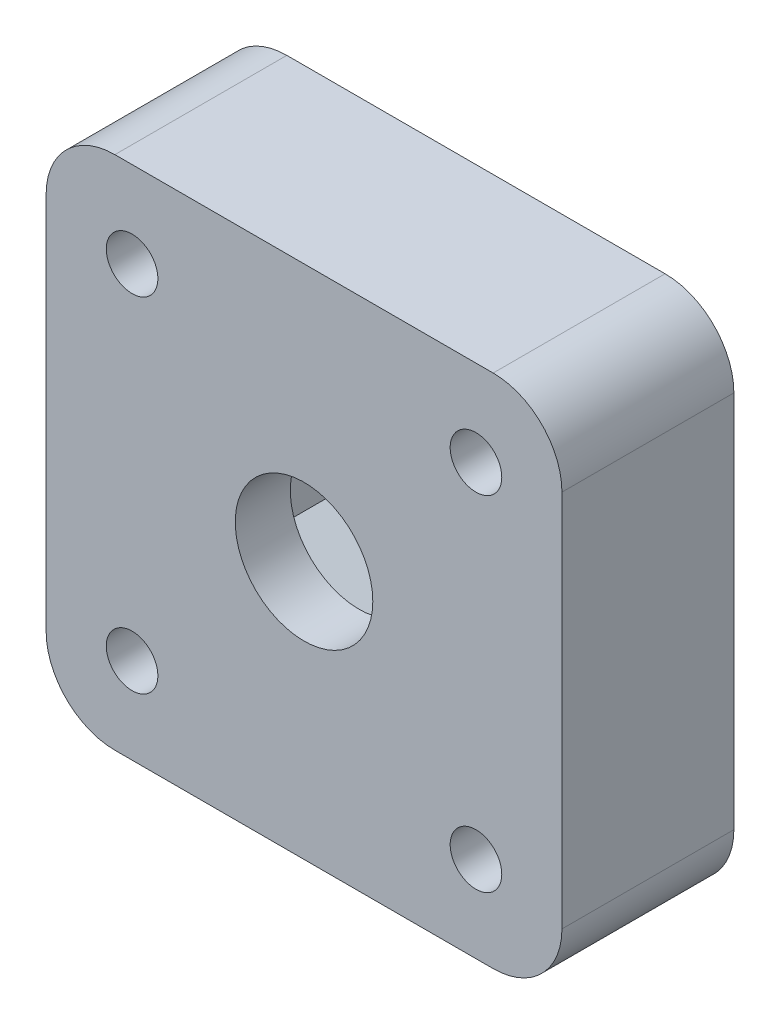
ISO-10303-21;
HEADER;
FILE_DESCRIPTION(('STEP AP214'),'2;1');
FILE_NAME('part.step','',(''),(''),'','','');
FILE_SCHEMA(('AUTOMOTIVE_DESIGN { 1 0 10303 214 1 1 1 1 }'));
ENDSEC;
DATA;
#1=APPLICATION_CONTEXT('core data for automotive mechanical design processes');
#2=APPLICATION_PROTOCOL_DEFINITION('international standard','automotive_design',2000,#1);
#3=PRODUCT_CONTEXT('',#1,'mechanical');
#4=PRODUCT('Part','Part','',(#3));
#5=PRODUCT_RELATED_PRODUCT_CATEGORY('part','',(#4));
#6=PRODUCT_DEFINITION_FORMATION('','',#4);
#7=PRODUCT_DEFINITION_CONTEXT('part definition',#1,'design');
#8=PRODUCT_DEFINITION('design','',#6,#7);
#9=PRODUCT_DEFINITION_SHAPE('','',#8);
#10=(LENGTH_UNIT() NAMED_UNIT(*) SI_UNIT(.MILLI.,.METRE.));
#11=(NAMED_UNIT(*) PLANE_ANGLE_UNIT() SI_UNIT($,.RADIAN.));
#12=(NAMED_UNIT(*) SI_UNIT($,.STERADIAN.) SOLID_ANGLE_UNIT());
#13=UNCERTAINTY_MEASURE_WITH_UNIT(LENGTH_MEASURE(1.E-05),#10,'distance_accuracy_value','');
#14=(GEOMETRIC_REPRESENTATION_CONTEXT(3) GLOBAL_UNCERTAINTY_ASSIGNED_CONTEXT((#13)) GLOBAL_UNIT_ASSIGNED_CONTEXT((#10,
#11,#12)) REPRESENTATION_CONTEXT('',''));
#15=CARTESIAN_POINT('',(0.,0.,0.));
#16=DIRECTION('',(0.,0.,1.));
#17=DIRECTION('',(1.,0.,0.));
#18=AXIS2_PLACEMENT_3D('',#15,#16,#17);
#19=CARTESIAN_POINT('',(0.,0.,0.));
#20=DIRECTION('',(0.,0.,1.));
#21=DIRECTION('',(1.,0.,0.));
#22=AXIS2_PLACEMENT_3D('',#19,#20,#21);
#23=PLANE('',#22);
#24=CARTESIAN_POINT('',(-10.,-10.,0.));
#25=DIRECTION('',(0.,0.,1.));
#26=DIRECTION('',(1.,0.,0.));
#27=AXIS2_PLACEMENT_3D('',#24,#25,#26);
#28=CIRCLE('',#27,1.5);
#29=CARTESIAN_POINT('',(-8.5,-10.,0.));
#30=VERTEX_POINT('',#29);
#31=EDGE_CURVE('E174',#30,#30,#28,.F.);
#32=ORIENTED_EDGE('',*,*,#31,.F.);
#33=EDGE_LOOP('',(#32));
#34=FACE_BOUND('',#33,.T.);
#35=CARTESIAN_POINT('',(10.,-10.,0.));
#36=DIRECTION('',(0.,0.,1.));
#37=DIRECTION('',(1.,0.,0.));
#38=AXIS2_PLACEMENT_3D('',#35,#36,#37);
#39=CIRCLE('',#38,1.5);
#40=CARTESIAN_POINT('',(11.5,-10.,0.));
#41=VERTEX_POINT('',#40);
#42=EDGE_CURVE('E213',#41,#41,#39,.T.);
#43=ORIENTED_EDGE('',*,*,#42,.T.);
#44=EDGE_LOOP('',(#43));
#45=FACE_BOUND('',#44,.T.);
#46=DIRECTION('',(0.,1.,0.));
#47=VECTOR('',#46,1.);
#48=CARTESIAN_POINT('',(-15.,0.,0.));
#49=LINE('',#48,#47);
#50=CARTESIAN_POINT('',(-15.,-11.,0.));
#51=VERTEX_POINT('',#50);
#52=CARTESIAN_POINT('',(-15.,11.,0.));
#53=VERTEX_POINT('',#52);
#54=EDGE_CURVE('E210',#51,#53,#49,.T.);
#55=ORIENTED_EDGE('',*,*,#54,.T.);
#56=CARTESIAN_POINT('',(-11.,11.,0.));
#57=DIRECTION('',(0.,0.,1.));
#58=DIRECTION('',(1.,0.,0.));
#59=AXIS2_PLACEMENT_3D('',#56,#57,#58);
#60=CIRCLE('',#59,4.);
#61=CARTESIAN_POINT('',(-11.,15.,0.));
#62=VERTEX_POINT('',#61);
#63=EDGE_CURVE('E228',#53,#62,#60,.F.);
#64=ORIENTED_EDGE('',*,*,#63,.T.);
#65=DIRECTION('',(1.,0.,0.));
#66=VECTOR('',#65,1.);
#67=CARTESIAN_POINT('',(0.,15.,0.));
#68=LINE('',#67,#66);
#69=CARTESIAN_POINT('',(11.,15.,0.));
#70=VERTEX_POINT('',#69);
#71=EDGE_CURVE('E207',#62,#70,#68,.T.);
#72=ORIENTED_EDGE('',*,*,#71,.T.);
#73=CARTESIAN_POINT('',(11.,11.,0.));
#74=DIRECTION('',(0.,0.,1.));
#75=DIRECTION('',(1.,0.,0.));
#76=AXIS2_PLACEMENT_3D('',#73,#74,#75);
#77=CIRCLE('',#76,4.);
#78=CARTESIAN_POINT('',(15.,11.,0.));
#79=VERTEX_POINT('',#78);
#80=EDGE_CURVE('E222',#70,#79,#77,.F.);
#81=ORIENTED_EDGE('',*,*,#80,.T.);
#82=DIRECTION('',(0.,1.,0.));
#83=VECTOR('',#82,1.);
#84=CARTESIAN_POINT('',(15.,0.,0.));
#85=LINE('',#84,#83);
#86=CARTESIAN_POINT('',(15.,-11.,0.));
#87=VERTEX_POINT('',#86);
#88=EDGE_CURVE('E205',#87,#79,#85,.T.);
#89=ORIENTED_EDGE('',*,*,#88,.F.);
#90=CARTESIAN_POINT('',(11.,-11.,0.));
#91=DIRECTION('',(0.,0.,1.));
#92=DIRECTION('',(1.,0.,0.));
#93=AXIS2_PLACEMENT_3D('',#90,#91,#92);
#94=CIRCLE('',#93,4.);
#95=CARTESIAN_POINT('',(11.,-15.,0.));
#96=VERTEX_POINT('',#95);
#97=EDGE_CURVE('E224',#87,#96,#94,.F.);
#98=ORIENTED_EDGE('',*,*,#97,.T.);
#99=DIRECTION('',(1.,0.,0.));
#100=VECTOR('',#99,1.);
#101=CARTESIAN_POINT('',(0.,-15.,0.));
#102=LINE('',#101,#100);
#103=CARTESIAN_POINT('',(-11.,-15.,0.));
#104=VERTEX_POINT('',#103);
#105=EDGE_CURVE('E202',#104,#96,#102,.T.);
#106=ORIENTED_EDGE('',*,*,#105,.F.);
#107=CARTESIAN_POINT('',(-11.,-11.,0.));
#108=DIRECTION('',(0.,0.,1.));
#109=DIRECTION('',(1.,0.,0.));
#110=AXIS2_PLACEMENT_3D('',#107,#108,#109);
#111=CIRCLE('',#110,4.);
#112=EDGE_CURVE('E226',#104,#51,#111,.F.);
#113=ORIENTED_EDGE('',*,*,#112,.T.);
#114=EDGE_LOOP('',(#55,#64,#72,#81,#89,#98,#106,#113));
#115=FACE_BOUND('',#114,.T.);
#116=CARTESIAN_POINT('',(-10.,10.,0.));
#117=DIRECTION('',(0.,0.,1.));
#118=DIRECTION('',(1.,0.,0.));
#119=AXIS2_PLACEMENT_3D('',#116,#117,#118);
#120=CIRCLE('',#119,1.5);
#121=CARTESIAN_POINT('',(-8.5,10.,0.));
#122=VERTEX_POINT('',#121);
#123=EDGE_CURVE('E199',#122,#122,#120,.T.);
#124=ORIENTED_EDGE('',*,*,#123,.T.);
#125=EDGE_LOOP('',(#124));
#126=FACE_BOUND('',#125,.T.);
#127=CARTESIAN_POINT('',(10.,10.,0.));
#128=DIRECTION('',(0.,0.,1.));
#129=DIRECTION('',(1.,0.,0.));
#130=AXIS2_PLACEMENT_3D('',#127,#128,#129);
#131=CIRCLE('',#130,1.5);
#132=CARTESIAN_POINT('',(11.5,10.,0.));
#133=VERTEX_POINT('',#132);
#134=EDGE_CURVE('E164',#133,#133,#131,.F.);
#135=ORIENTED_EDGE('',*,*,#134,.F.);
#136=EDGE_LOOP('',(#135));
#137=FACE_BOUND('',#136,.T.);
#138=DIRECTION('',(-0.866025403784438,0.5,0.));
#139=VECTOR('',#138,1.);
#140=CARTESIAN_POINT('',(6.,3.46410161513775,0.));
#141=LINE('',#140,#139);
#142=CARTESIAN_POINT('',(6.,3.46410161513775,0.));
#143=VERTEX_POINT('',#142);
#144=CARTESIAN_POINT('',(0.,6.92820323027551,0.));
#145=VERTEX_POINT('',#144);
#146=EDGE_CURVE('E333',#143,#145,#141,.T.);
#147=ORIENTED_EDGE('',*,*,#146,.T.);
#148=DIRECTION('',(-0.866025403784439,-0.5,0.));
#149=VECTOR('',#148,1.);
#150=CARTESIAN_POINT('',(0.,6.92820323027551,0.));
#151=LINE('',#150,#149);
#152=CARTESIAN_POINT('',(-6.,3.46410161513775,0.));
#153=VERTEX_POINT('',#152);
#154=EDGE_CURVE('E159',#145,#153,#151,.T.);
#155=ORIENTED_EDGE('',*,*,#154,.T.);
#156=DIRECTION('',(0.,-1.,0.));
#157=VECTOR('',#156,1.);
#158=CARTESIAN_POINT('',(-6.,3.46410161513775,0.));
#159=LINE('',#158,#157);
#160=CARTESIAN_POINT('',(-6.,-3.46410161513776,0.));
#161=VERTEX_POINT('',#160);
#162=EDGE_CURVE('E338',#153,#161,#159,.T.);
#163=ORIENTED_EDGE('',*,*,#162,.T.);
#164=DIRECTION('',(0.866025403784438,-0.5,0.));
#165=VECTOR('',#164,1.);
#166=CARTESIAN_POINT('',(-6.,-3.46410161513776,0.));
#167=LINE('',#166,#165);
#168=CARTESIAN_POINT('',(0.,-6.92820323027551,0.));
#169=VERTEX_POINT('',#168);
#170=EDGE_CURVE('E345',#161,#169,#167,.T.);
#171=ORIENTED_EDGE('',*,*,#170,.T.);
#172=DIRECTION('',(0.866025403784438,0.5,0.));
#173=VECTOR('',#172,1.);
#174=CARTESIAN_POINT('',(0.,-6.92820323027551,0.));
#175=LINE('',#174,#173);
#176=CARTESIAN_POINT('',(6.,-3.46410161513776,0.));
#177=VERTEX_POINT('',#176);
#178=EDGE_CURVE('E348',#169,#177,#175,.T.);
#179=ORIENTED_EDGE('',*,*,#178,.T.);
#180=DIRECTION('',(0.,1.,0.));
#181=VECTOR('',#180,1.);
#182=CARTESIAN_POINT('',(6.,-3.46410161513776,0.));
#183=LINE('',#182,#181);
#184=EDGE_CURVE('E155',#177,#143,#183,.T.);
#185=ORIENTED_EDGE('',*,*,#184,.T.);
#186=EDGE_LOOP('',(#147,#155,#163,#171,#179,#185));
#187=FACE_BOUND('',#186,.T.);
#188=ADVANCED_FACE('F34',(#34,#45,#115,#126,#137,#187),#23,.F.);
#189=CARTESIAN_POINT('',(0.,-15.,10.));
#190=DIRECTION('',(0.,1.,0.));
#191=DIRECTION('',(0.,0.,1.));
#192=AXIS2_PLACEMENT_3D('',#189,#190,#191);
#193=PLANE('',#192);
#194=DIRECTION('',(1.,0.,0.));
#195=VECTOR('',#194,1.);
#196=CARTESIAN_POINT('',(0.,-15.,10.));
#197=LINE('',#196,#195);
#198=CARTESIAN_POINT('',(-11.,-15.,10.));
#199=VERTEX_POINT('',#198);
#200=CARTESIAN_POINT('',(11.,-15.,10.));
#201=VERTEX_POINT('',#200);
#202=EDGE_CURVE('E177',#199,#201,#197,.T.);
#203=ORIENTED_EDGE('',*,*,#202,.F.);
#204=DIRECTION('',(0.,0.,-1.));
#205=VECTOR('',#204,1.);
#206=CARTESIAN_POINT('',(-11.,-15.,0.));
#207=LINE('',#206,#205);
#208=EDGE_CURVE('E244',#199,#104,#207,.T.);
#209=ORIENTED_EDGE('',*,*,#208,.T.);
#210=ORIENTED_EDGE('',*,*,#105,.T.);
#211=DIRECTION('',(0.,0.,-1.));
#212=VECTOR('',#211,1.);
#213=CARTESIAN_POINT('',(11.,-15.,10.));
#214=LINE('',#213,#212);
#215=EDGE_CURVE('E242',#96,#201,#214,.F.);
#216=ORIENTED_EDGE('',*,*,#215,.T.);
#217=EDGE_LOOP('',(#203,#209,#210,#216));
#218=FACE_BOUND('',#217,.T.);
#219=ADVANCED_FACE('F250',(#218),#193,.F.);
#220=CARTESIAN_POINT('',(15.,0.,10.));
#221=DIRECTION('',(-1.,0.,0.));
#222=DIRECTION('',(0.,0.,1.));
#223=AXIS2_PLACEMENT_3D('',#220,#221,#222);
#224=PLANE('',#223);
#225=DIRECTION('',(0.,1.,0.));
#226=VECTOR('',#225,1.);
#227=CARTESIAN_POINT('',(15.,0.,10.));
#228=LINE('',#227,#226);
#229=CARTESIAN_POINT('',(15.,-11.,10.));
#230=VERTEX_POINT('',#229);
#231=CARTESIAN_POINT('',(15.,11.,10.));
#232=VERTEX_POINT('',#231);
#233=EDGE_CURVE('E179',#230,#232,#228,.T.);
#234=ORIENTED_EDGE('',*,*,#233,.F.);
#235=DIRECTION('',(0.,0.,-1.));
#236=VECTOR('',#235,1.);
#237=CARTESIAN_POINT('',(15.,-11.,10.));
#238=LINE('',#237,#236);
#239=EDGE_CURVE('E11',#230,#87,#238,.T.);
#240=ORIENTED_EDGE('',*,*,#239,.T.);
#241=ORIENTED_EDGE('',*,*,#88,.T.);
#242=DIRECTION('',(0.,0.,-1.));
#243=VECTOR('',#242,1.);
#244=CARTESIAN_POINT('',(15.,11.,10.));
#245=LINE('',#244,#243);
#246=EDGE_CURVE('E42',#79,#232,#245,.F.);
#247=ORIENTED_EDGE('',*,*,#246,.T.);
#248=EDGE_LOOP('',(#234,#240,#241,#247));
#249=FACE_BOUND('',#248,.T.);
#250=ADVANCED_FACE('F261',(#249),#224,.F.);
#251=CARTESIAN_POINT('',(0.,15.,10.));
#252=DIRECTION('',(0.,1.,0.));
#253=DIRECTION('',(0.,0.,1.));
#254=AXIS2_PLACEMENT_3D('',#251,#252,#253);
#255=PLANE('',#254);
#256=ORIENTED_EDGE('',*,*,#71,.F.);
#257=DIRECTION('',(0.,0.,-1.));
#258=VECTOR('',#257,1.);
#259=CARTESIAN_POINT('',(-11.,15.,10.));
#260=LINE('',#259,#258);
#261=CARTESIAN_POINT('',(-11.,15.,10.));
#262=VERTEX_POINT('',#261);
#263=EDGE_CURVE('E233',#62,#262,#260,.F.);
#264=ORIENTED_EDGE('',*,*,#263,.T.);
#265=DIRECTION('',(1.,0.,0.));
#266=VECTOR('',#265,1.);
#267=CARTESIAN_POINT('',(0.,15.,10.));
#268=LINE('',#267,#266);
#269=CARTESIAN_POINT('',(11.,15.,10.));
#270=VERTEX_POINT('',#269);
#271=EDGE_CURVE('E181',#262,#270,#268,.T.);
#272=ORIENTED_EDGE('',*,*,#271,.T.);
#273=DIRECTION('',(0.,0.,-1.));
#274=VECTOR('',#273,1.);
#275=CARTESIAN_POINT('',(11.,15.,0.));
#276=LINE('',#275,#274);
#277=EDGE_CURVE('E230',#270,#70,#276,.T.);
#278=ORIENTED_EDGE('',*,*,#277,.T.);
#279=EDGE_LOOP('',(#256,#264,#272,#278));
#280=FACE_BOUND('',#279,.T.);
#281=ADVANCED_FACE('F270',(#280),#255,.T.);
#282=CARTESIAN_POINT('',(-10.,-10.,10.));
#283=DIRECTION('',(0.,0.,-1.));
#284=DIRECTION('',(-1.,0.,0.));
#285=AXIS2_PLACEMENT_3D('',#282,#283,#284);
#286=CYLINDRICAL_SURFACE('',#285,1.5);
#287=CARTESIAN_POINT('',(-10.,-10.,10.));
#288=DIRECTION('',(0.,0.,1.));
#289=DIRECTION('',(1.,0.,0.));
#290=AXIS2_PLACEMENT_3D('',#287,#288,#289);
#291=CIRCLE('',#290,1.5);
#292=CARTESIAN_POINT('',(-8.5,-10.,10.));
#293=VERTEX_POINT('',#292);
#294=EDGE_CURVE('E190',#293,#293,#291,.F.);
#295=ORIENTED_EDGE('',*,*,#294,.F.);
#296=EDGE_LOOP('',(#295));
#297=FACE_BOUND('',#296,.T.);
#298=ORIENTED_EDGE('',*,*,#31,.T.);
#299=EDGE_LOOP('',(#298));
#300=FACE_BOUND('',#299,.T.);
#301=ADVANCED_FACE('F305',(#297,#300),#286,.F.);
#302=CARTESIAN_POINT('',(10.,-10.,10.));
#303=DIRECTION('',(0.,0.,-1.));
#304=DIRECTION('',(-1.,0.,0.));
#305=AXIS2_PLACEMENT_3D('',#302,#303,#304);
#306=CYLINDRICAL_SURFACE('',#305,1.5);
#307=CARTESIAN_POINT('',(10.,-10.,10.));
#308=DIRECTION('',(0.,0.,1.));
#309=DIRECTION('',(1.,0.,0.));
#310=AXIS2_PLACEMENT_3D('',#307,#308,#309);
#311=CIRCLE('',#310,1.5);
#312=CARTESIAN_POINT('',(11.5,-10.,10.));
#313=VERTEX_POINT('',#312);
#314=EDGE_CURVE('E187',#313,#313,#311,.T.);
#315=ORIENTED_EDGE('',*,*,#314,.T.);
#316=EDGE_LOOP('',(#315));
#317=FACE_BOUND('',#316,.T.);
#318=ORIENTED_EDGE('',*,*,#42,.F.);
#319=EDGE_LOOP('',(#318));
#320=FACE_BOUND('',#319,.T.);
#321=ADVANCED_FACE('F308',(#317,#320),#306,.F.);
#322=CARTESIAN_POINT('',(-15.,0.,10.));
#323=DIRECTION('',(-1.,0.,0.));
#324=DIRECTION('',(0.,0.,1.));
#325=AXIS2_PLACEMENT_3D('',#322,#323,#324);
#326=PLANE('',#325);
#327=DIRECTION('',(0.,1.,0.));
#328=VECTOR('',#327,1.);
#329=CARTESIAN_POINT('',(-15.,0.,10.));
#330=LINE('',#329,#328);
#331=CARTESIAN_POINT('',(-15.,-11.,10.));
#332=VERTEX_POINT('',#331);
#333=CARTESIAN_POINT('',(-15.,11.,10.));
#334=VERTEX_POINT('',#333);
#335=EDGE_CURVE('E184',#332,#334,#330,.T.);
#336=ORIENTED_EDGE('',*,*,#335,.T.);
#337=DIRECTION('',(0.,0.,-1.));
#338=VECTOR('',#337,1.);
#339=CARTESIAN_POINT('',(-15.,11.,10.));
#340=LINE('',#339,#338);
#341=EDGE_CURVE('E219',#334,#53,#340,.T.);
#342=ORIENTED_EDGE('',*,*,#341,.T.);
#343=ORIENTED_EDGE('',*,*,#54,.F.);
#344=DIRECTION('',(0.,0.,-1.));
#345=VECTOR('',#344,1.);
#346=CARTESIAN_POINT('',(-15.,-11.,10.));
#347=LINE('',#346,#345);
#348=EDGE_CURVE('E196',#51,#332,#347,.F.);
#349=ORIENTED_EDGE('',*,*,#348,.T.);
#350=EDGE_LOOP('',(#336,#342,#343,#349));
#351=FACE_BOUND('',#350,.T.);
#352=ADVANCED_FACE('F277',(#351),#326,.T.);
#353=CARTESIAN_POINT('',(-10.,10.,10.));
#354=DIRECTION('',(0.,0.,-1.));
#355=DIRECTION('',(-1.,0.,0.));
#356=AXIS2_PLACEMENT_3D('',#353,#354,#355);
#357=CYLINDRICAL_SURFACE('',#356,1.5);
#358=CARTESIAN_POINT('',(-10.,10.,10.));
#359=DIRECTION('',(0.,0.,1.));
#360=DIRECTION('',(1.,0.,0.));
#361=AXIS2_PLACEMENT_3D('',#358,#359,#360);
#362=CIRCLE('',#361,1.5);
#363=CARTESIAN_POINT('',(-8.5,10.,10.));
#364=VERTEX_POINT('',#363);
#365=EDGE_CURVE('E173',#364,#364,#362,.T.);
#366=ORIENTED_EDGE('',*,*,#365,.T.);
#367=EDGE_LOOP('',(#366));
#368=FACE_BOUND('',#367,.T.);
#369=ORIENTED_EDGE('',*,*,#123,.F.);
#370=EDGE_LOOP('',(#369));
#371=FACE_BOUND('',#370,.T.);
#372=ADVANCED_FACE('F315',(#368,#371),#357,.F.);
#373=CARTESIAN_POINT('',(10.,10.,10.));
#374=DIRECTION('',(0.,0.,-1.));
#375=DIRECTION('',(-1.,0.,0.));
#376=AXIS2_PLACEMENT_3D('',#373,#374,#375);
#377=CYLINDRICAL_SURFACE('',#376,1.5);
#378=CARTESIAN_POINT('',(10.,10.,10.));
#379=DIRECTION('',(0.,0.,1.));
#380=DIRECTION('',(1.,0.,0.));
#381=AXIS2_PLACEMENT_3D('',#378,#379,#380);
#382=CIRCLE('',#381,1.5);
#383=CARTESIAN_POINT('',(11.5,10.,10.));
#384=VERTEX_POINT('',#383);
#385=EDGE_CURVE('E170',#384,#384,#382,.F.);
#386=ORIENTED_EDGE('',*,*,#385,.F.);
#387=EDGE_LOOP('',(#386));
#388=FACE_BOUND('',#387,.T.);
#389=ORIENTED_EDGE('',*,*,#134,.T.);
#390=EDGE_LOOP('',(#389));
#391=FACE_BOUND('',#390,.T.);
#392=ADVANCED_FACE('F303',(#388,#391),#377,.F.);
#393=CARTESIAN_POINT('',(0.,0.,10.));
#394=DIRECTION('',(0.,0.,-1.));
#395=DIRECTION('',(-1.,0.,0.));
#396=AXIS2_PLACEMENT_3D('',#393,#394,#395);
#397=CYLINDRICAL_SURFACE('',#396,4.);
#398=CARTESIAN_POINT('',(0.,0.,6.8));
#399=DIRECTION('',(0.,0.,1.));
#400=DIRECTION('',(1.,0.,0.));
#401=AXIS2_PLACEMENT_3D('',#398,#399,#400);
#402=CIRCLE('',#401,4.);
#403=CARTESIAN_POINT('',(4.,0.,6.8));
#404=VERTEX_POINT('',#403);
#405=EDGE_CURVE('E160',#404,#404,#402,.T.);
#406=ORIENTED_EDGE('',*,*,#405,.F.);
#407=EDGE_LOOP('',(#406));
#408=FACE_BOUND('',#407,.T.);
#409=CARTESIAN_POINT('',(0.,0.,10.));
#410=DIRECTION('',(0.,0.,1.));
#411=DIRECTION('',(1.,0.,0.));
#412=AXIS2_PLACEMENT_3D('',#409,#410,#411);
#413=CIRCLE('',#412,4.);
#414=CARTESIAN_POINT('',(4.,0.,10.));
#415=VERTEX_POINT('',#414);
#416=EDGE_CURVE('E193',#415,#415,#413,.T.);
#417=ORIENTED_EDGE('',*,*,#416,.T.);
#418=EDGE_LOOP('',(#417));
#419=FACE_BOUND('',#418,.T.);
#420=ADVANCED_FACE('F300',(#408,#419),#397,.F.);
#421=CARTESIAN_POINT('',(0.,0.,10.));
#422=DIRECTION('',(0.,0.,1.));
#423=DIRECTION('',(1.,0.,0.));
#424=AXIS2_PLACEMENT_3D('',#421,#422,#423);
#425=PLANE('',#424);
#426=ORIENTED_EDGE('',*,*,#385,.T.);
#427=EDGE_LOOP('',(#426));
#428=FACE_BOUND('',#427,.T.);
#429=ORIENTED_EDGE('',*,*,#365,.F.);
#430=EDGE_LOOP('',(#429));
#431=FACE_BOUND('',#430,.T.);
#432=ORIENTED_EDGE('',*,*,#271,.F.);
#433=CARTESIAN_POINT('',(-11.,11.,10.));
#434=DIRECTION('',(0.,0.,1.));
#435=DIRECTION('',(1.,0.,0.));
#436=AXIS2_PLACEMENT_3D('',#433,#434,#435);
#437=CIRCLE('',#436,4.);
#438=EDGE_CURVE('E240',#262,#334,#437,.T.);
#439=ORIENTED_EDGE('',*,*,#438,.T.);
#440=ORIENTED_EDGE('',*,*,#335,.F.);
#441=CARTESIAN_POINT('',(-11.,-11.,10.));
#442=DIRECTION('',(0.,0.,1.));
#443=DIRECTION('',(1.,0.,0.));
#444=AXIS2_PLACEMENT_3D('',#441,#442,#443);
#445=CIRCLE('',#444,4.);
#446=EDGE_CURVE('E238',#332,#199,#445,.T.);
#447=ORIENTED_EDGE('',*,*,#446,.T.);
#448=ORIENTED_EDGE('',*,*,#202,.T.);
#449=CARTESIAN_POINT('',(11.,-11.,10.));
#450=DIRECTION('',(0.,0.,1.));
#451=DIRECTION('',(1.,0.,0.));
#452=AXIS2_PLACEMENT_3D('',#449,#450,#451);
#453=CIRCLE('',#452,4.);
#454=EDGE_CURVE('E55',#201,#230,#453,.T.);
#455=ORIENTED_EDGE('',*,*,#454,.T.);
#456=ORIENTED_EDGE('',*,*,#233,.T.);
#457=CARTESIAN_POINT('',(11.,11.,10.));
#458=DIRECTION('',(0.,0.,1.));
#459=DIRECTION('',(1.,0.,0.));
#460=AXIS2_PLACEMENT_3D('',#457,#458,#459);
#461=CIRCLE('',#460,4.);
#462=EDGE_CURVE('E235',#232,#270,#461,.T.);
#463=ORIENTED_EDGE('',*,*,#462,.T.);
#464=EDGE_LOOP('',(#432,#439,#440,#447,#448,#455,#456,#463));
#465=FACE_BOUND('',#464,.T.);
#466=ORIENTED_EDGE('',*,*,#314,.F.);
#467=EDGE_LOOP('',(#466));
#468=FACE_BOUND('',#467,.T.);
#469=ORIENTED_EDGE('',*,*,#294,.T.);
#470=EDGE_LOOP('',(#469));
#471=FACE_BOUND('',#470,.T.);
#472=ORIENTED_EDGE('',*,*,#416,.F.);
#473=EDGE_LOOP('',(#472));
#474=FACE_BOUND('',#473,.T.);
#475=ADVANCED_FACE('F264',(#428,#431,#465,#468,#471,#474),#425,.T.);
#476=CARTESIAN_POINT('',(6.,3.46410161513775,6.8));
#477=DIRECTION('',(-0.5,-0.866025403784438,0.));
#478=DIRECTION('',(0.866025403784439,-0.5,0.));
#479=AXIS2_PLACEMENT_3D('',#476,#477,#478);
#480=PLANE('',#479);
#481=ORIENTED_EDGE('',*,*,#146,.F.);
#482=DIRECTION('',(0.,0.,-1.));
#483=VECTOR('',#482,1.);
#484=CARTESIAN_POINT('',(6.,3.46410161513775,6.8));
#485=LINE('',#484,#483);
#486=CARTESIAN_POINT('',(6.,3.46410161513775,6.8));
#487=VERTEX_POINT('',#486);
#488=EDGE_CURVE('E154',#487,#143,#485,.T.);
#489=ORIENTED_EDGE('',*,*,#488,.F.);
#490=DIRECTION('',(-0.866025403784438,0.5,0.));
#491=VECTOR('',#490,1.);
#492=CARTESIAN_POINT('',(6.,3.46410161513775,6.8));
#493=LINE('',#492,#491);
#494=CARTESIAN_POINT('',(0.,6.92820323027551,6.8));
#495=VERTEX_POINT('',#494);
#496=EDGE_CURVE('E140',#487,#495,#493,.T.);
#497=ORIENTED_EDGE('',*,*,#496,.T.);
#498=DIRECTION('',(0.,0.,-1.));
#499=VECTOR('',#498,1.);
#500=CARTESIAN_POINT('',(0.,6.92820323027551,6.8));
#501=LINE('',#500,#499);
#502=EDGE_CURVE('E151',#495,#145,#501,.T.);
#503=ORIENTED_EDGE('',*,*,#502,.T.);
#504=EDGE_LOOP('',(#481,#489,#497,#503));
#505=FACE_BOUND('',#504,.T.);
#506=ADVANCED_FACE('F150',(#505),#480,.T.);
#507=CARTESIAN_POINT('',(0.,6.92820323027551,6.8));
#508=DIRECTION('',(0.5,-0.866025403784439,0.));
#509=DIRECTION('',(0.866025403784439,0.5,0.));
#510=AXIS2_PLACEMENT_3D('',#507,#508,#509);
#511=PLANE('',#510);
#512=ORIENTED_EDGE('',*,*,#154,.F.);
#513=ORIENTED_EDGE('',*,*,#502,.F.);
#514=DIRECTION('',(-0.866025403784439,-0.5,0.));
#515=VECTOR('',#514,1.);
#516=CARTESIAN_POINT('',(0.,6.92820323027551,6.8));
#517=LINE('',#516,#515);
#518=CARTESIAN_POINT('',(-6.,3.46410161513775,6.8));
#519=VERTEX_POINT('',#518);
#520=EDGE_CURVE('E136',#495,#519,#517,.T.);
#521=ORIENTED_EDGE('',*,*,#520,.T.);
#522=DIRECTION('',(0.,0.,-1.));
#523=VECTOR('',#522,1.);
#524=CARTESIAN_POINT('',(-6.,3.46410161513775,6.8));
#525=LINE('',#524,#523);
#526=EDGE_CURVE('E161',#519,#153,#525,.T.);
#527=ORIENTED_EDGE('',*,*,#526,.T.);
#528=EDGE_LOOP('',(#512,#513,#521,#527));
#529=FACE_BOUND('',#528,.T.);
#530=ADVANCED_FACE('F157',(#529),#511,.T.);
#531=CARTESIAN_POINT('',(-6.,3.46410161513775,6.8));
#532=DIRECTION('',(1.,0.,0.));
#533=DIRECTION('',(0.,0.,-1.));
#534=AXIS2_PLACEMENT_3D('',#531,#532,#533);
#535=PLANE('',#534);
#536=ORIENTED_EDGE('',*,*,#162,.F.);
#537=ORIENTED_EDGE('',*,*,#526,.F.);
#538=DIRECTION('',(0.,-1.,0.));
#539=VECTOR('',#538,1.);
#540=CARTESIAN_POINT('',(-6.,3.46410161513775,6.8));
#541=LINE('',#540,#539);
#542=CARTESIAN_POINT('',(-6.,-3.46410161513776,6.8));
#543=VERTEX_POINT('',#542);
#544=EDGE_CURVE('E142',#519,#543,#541,.T.);
#545=ORIENTED_EDGE('',*,*,#544,.T.);
#546=DIRECTION('',(0.,0.,-1.));
#547=VECTOR('',#546,1.);
#548=CARTESIAN_POINT('',(-6.,-3.46410161513776,6.8));
#549=LINE('',#548,#547);
#550=EDGE_CURVE('E166',#543,#161,#549,.T.);
#551=ORIENTED_EDGE('',*,*,#550,.T.);
#552=EDGE_LOOP('',(#536,#537,#545,#551));
#553=FACE_BOUND('',#552,.T.);
#554=ADVANCED_FACE('F359',(#553),#535,.T.);
#555=CARTESIAN_POINT('',(-6.,-3.46410161513776,6.8));
#556=DIRECTION('',(0.5,0.866025403784439,0.));
#557=DIRECTION('',(-0.866025403784439,0.5,0.));
#558=AXIS2_PLACEMENT_3D('',#555,#556,#557);
#559=PLANE('',#558);
#560=ORIENTED_EDGE('',*,*,#170,.F.);
#561=ORIENTED_EDGE('',*,*,#550,.F.);
#562=DIRECTION('',(0.866025403784438,-0.5,0.));
#563=VECTOR('',#562,1.);
#564=CARTESIAN_POINT('',(-6.,-3.46410161513776,6.8));
#565=LINE('',#564,#563);
#566=CARTESIAN_POINT('',(0.,-6.92820323027551,6.8));
#567=VERTEX_POINT('',#566);
#568=EDGE_CURVE('E371',#543,#567,#565,.T.);
#569=ORIENTED_EDGE('',*,*,#568,.T.);
#570=DIRECTION('',(0.,0.,-1.));
#571=VECTOR('',#570,1.);
#572=CARTESIAN_POINT('',(0.,-6.92820323027551,6.8));
#573=LINE('',#572,#571);
#574=EDGE_CURVE('E354',#567,#169,#573,.T.);
#575=ORIENTED_EDGE('',*,*,#574,.T.);
#576=EDGE_LOOP('',(#560,#561,#569,#575));
#577=FACE_BOUND('',#576,.T.);
#578=ADVANCED_FACE('F361',(#577),#559,.T.);
#579=CARTESIAN_POINT('',(0.,-6.92820323027551,6.8));
#580=DIRECTION('',(-0.5,0.866025403784439,0.));
#581=DIRECTION('',(-0.866025403784439,-0.5,0.));
#582=AXIS2_PLACEMENT_3D('',#579,#580,#581);
#583=PLANE('',#582);
#584=ORIENTED_EDGE('',*,*,#178,.F.);
#585=ORIENTED_EDGE('',*,*,#574,.F.);
#586=DIRECTION('',(0.866025403784438,0.5,0.));
#587=VECTOR('',#586,1.);
#588=CARTESIAN_POINT('',(0.,-6.92820323027551,6.8));
#589=LINE('',#588,#587);
#590=CARTESIAN_POINT('',(6.,-3.46410161513776,6.8));
#591=VERTEX_POINT('',#590);
#592=EDGE_CURVE('E368',#567,#591,#589,.T.);
#593=ORIENTED_EDGE('',*,*,#592,.T.);
#594=DIRECTION('',(0.,0.,-1.));
#595=VECTOR('',#594,1.);
#596=CARTESIAN_POINT('',(6.,-3.46410161513776,6.8));
#597=LINE('',#596,#595);
#598=EDGE_CURVE('E352',#591,#177,#597,.T.);
#599=ORIENTED_EDGE('',*,*,#598,.T.);
#600=EDGE_LOOP('',(#584,#585,#593,#599));
#601=FACE_BOUND('',#600,.T.);
#602=ADVANCED_FACE('F365',(#601),#583,.T.);
#603=CARTESIAN_POINT('',(6.,-3.46410161513776,6.8));
#604=DIRECTION('',(-1.,0.,0.));
#605=DIRECTION('',(0.,-1.,0.));
#606=AXIS2_PLACEMENT_3D('',#603,#604,#605);
#607=PLANE('',#606);
#608=ORIENTED_EDGE('',*,*,#184,.F.);
#609=ORIENTED_EDGE('',*,*,#598,.F.);
#610=DIRECTION('',(0.,1.,0.));
#611=VECTOR('',#610,1.);
#612=CARTESIAN_POINT('',(6.,-3.46410161513776,6.8));
#613=LINE('',#612,#611);
#614=EDGE_CURVE('E341',#591,#487,#613,.T.);
#615=ORIENTED_EDGE('',*,*,#614,.T.);
#616=ORIENTED_EDGE('',*,*,#488,.T.);
#617=EDGE_LOOP('',(#608,#609,#615,#616));
#618=FACE_BOUND('',#617,.T.);
#619=ADVANCED_FACE('F370',(#618),#607,.T.);
#620=CARTESIAN_POINT('',(0.,0.,6.8));
#621=DIRECTION('',(0.,0.,1.));
#622=DIRECTION('',(1.,0.,0.));
#623=AXIS2_PLACEMENT_3D('',#620,#621,#622);
#624=PLANE('',#623);
#625=ORIENTED_EDGE('',*,*,#405,.T.);
#626=EDGE_LOOP('',(#625));
#627=FACE_BOUND('',#626,.T.);
#628=ORIENTED_EDGE('',*,*,#496,.F.);
#629=ORIENTED_EDGE('',*,*,#614,.F.);
#630=ORIENTED_EDGE('',*,*,#592,.F.);
#631=ORIENTED_EDGE('',*,*,#568,.F.);
#632=ORIENTED_EDGE('',*,*,#544,.F.);
#633=ORIENTED_EDGE('',*,*,#520,.F.);
#634=EDGE_LOOP('',(#628,#629,#630,#631,#632,#633));
#635=FACE_BOUND('',#634,.T.);
#636=ADVANCED_FACE('F138',(#627,#635),#624,.F.);
#637=CARTESIAN_POINT('',(-11.,11.,10.));
#638=DIRECTION('',(0.,0.,-1.));
#639=DIRECTION('',(-1.,0.,0.));
#640=AXIS2_PLACEMENT_3D('',#637,#638,#639);
#641=CYLINDRICAL_SURFACE('',#640,4.);
#642=ORIENTED_EDGE('',*,*,#438,.F.);
#643=ORIENTED_EDGE('',*,*,#263,.F.);
#644=ORIENTED_EDGE('',*,*,#63,.F.);
#645=ORIENTED_EDGE('',*,*,#341,.F.);
#646=EDGE_LOOP('',(#642,#643,#644,#645));
#647=FACE_BOUND('',#646,.T.);
#648=ADVANCED_FACE('F275',(#647),#641,.T.);
#649=CARTESIAN_POINT('',(-11.,-11.,10.));
#650=DIRECTION('',(0.,0.,1.));
#651=DIRECTION('',(1.,0.,0.));
#652=AXIS2_PLACEMENT_3D('',#649,#650,#651);
#653=CYLINDRICAL_SURFACE('',#652,4.);
#654=ORIENTED_EDGE('',*,*,#446,.F.);
#655=ORIENTED_EDGE('',*,*,#348,.F.);
#656=ORIENTED_EDGE('',*,*,#112,.F.);
#657=ORIENTED_EDGE('',*,*,#208,.F.);
#658=EDGE_LOOP('',(#654,#655,#656,#657));
#659=FACE_BOUND('',#658,.T.);
#660=ADVANCED_FACE('F280',(#659),#653,.T.);
#661=CARTESIAN_POINT('',(11.,-11.,10.));
#662=DIRECTION('',(0.,0.,-1.));
#663=DIRECTION('',(-1.,0.,0.));
#664=AXIS2_PLACEMENT_3D('',#661,#662,#663);
#665=CYLINDRICAL_SURFACE('',#664,4.);
#666=ORIENTED_EDGE('',*,*,#454,.F.);
#667=ORIENTED_EDGE('',*,*,#215,.F.);
#668=ORIENTED_EDGE('',*,*,#97,.F.);
#669=ORIENTED_EDGE('',*,*,#239,.F.);
#670=EDGE_LOOP('',(#666,#667,#668,#669));
#671=FACE_BOUND('',#670,.T.);
#672=ADVANCED_FACE('F260',(#671),#665,.T.);
#673=CARTESIAN_POINT('',(11.,11.,10.));
#674=DIRECTION('',(0.,0.,1.));
#675=DIRECTION('',(1.,0.,0.));
#676=AXIS2_PLACEMENT_3D('',#673,#674,#675);
#677=CYLINDRICAL_SURFACE('',#676,4.);
#678=ORIENTED_EDGE('',*,*,#462,.F.);
#679=ORIENTED_EDGE('',*,*,#246,.F.);
#680=ORIENTED_EDGE('',*,*,#80,.F.);
#681=ORIENTED_EDGE('',*,*,#277,.F.);
#682=EDGE_LOOP('',(#678,#679,#680,#681));
#683=FACE_BOUND('',#682,.T.);
#684=ADVANCED_FACE('F36',(#683),#677,.T.);
#685=CLOSED_SHELL('',(#188,#219,#250,#281,#301,#321,#352,#372,#392,#420,#475,#506,#530,#554,
#578,#602,#619,#636,#648,#660,#672,#684));
#686=MANIFOLD_SOLID_BREP('B2',#685);
#687=ADVANCED_BREP_SHAPE_REPRESENTATION('',(#18,#686),#14);
#688=SHAPE_DEFINITION_REPRESENTATION(#9,#687);
ENDSEC;
END-ISO-10303-21;
